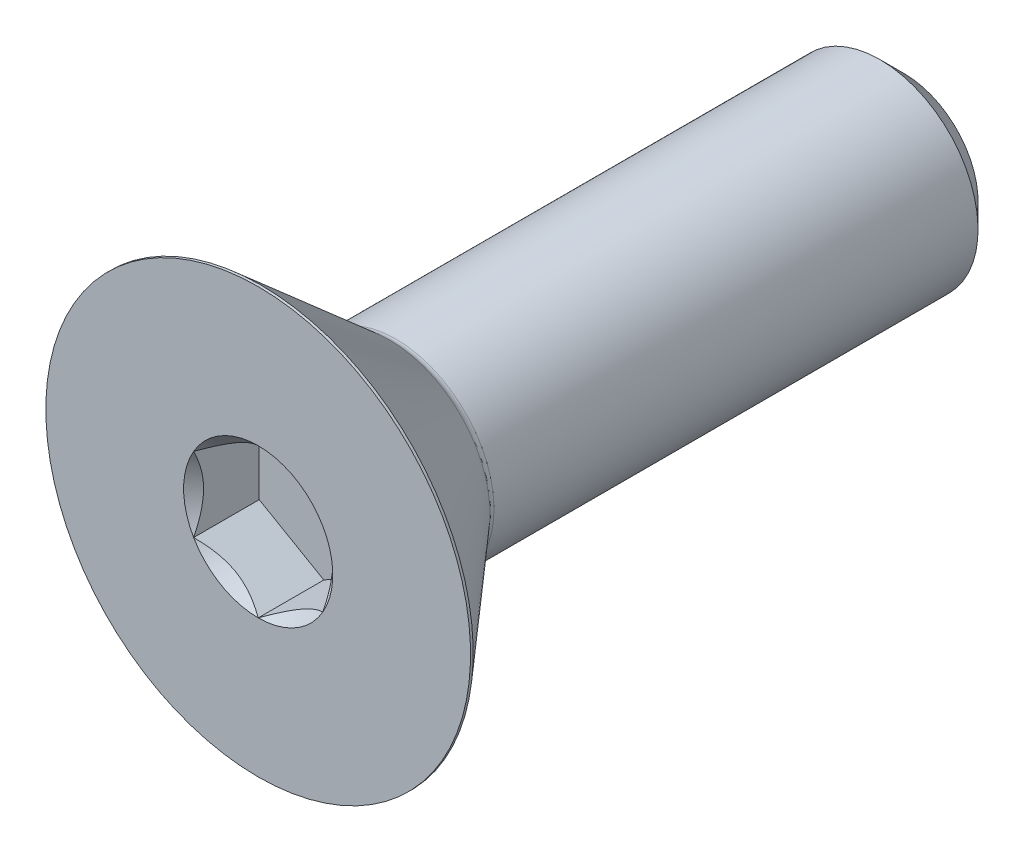
ISO-10303-21;
HEADER;
FILE_DESCRIPTION(('STEP AP214'),'2;1');
FILE_NAME('part.step','',(''),(''),'','','');
FILE_SCHEMA(('AUTOMOTIVE_DESIGN { 1 0 10303 214 1 1 1 1 }'));
ENDSEC;
DATA;
#1=APPLICATION_CONTEXT('core data for automotive mechanical design processes');
#2=APPLICATION_PROTOCOL_DEFINITION('international standard','automotive_design',2000,#1);
#3=PRODUCT_CONTEXT('',#1,'mechanical');
#4=PRODUCT('Part','Part','',(#3));
#5=PRODUCT_RELATED_PRODUCT_CATEGORY('part','',(#4));
#6=PRODUCT_DEFINITION_FORMATION('','',#4);
#7=PRODUCT_DEFINITION_CONTEXT('part definition',#1,'design');
#8=PRODUCT_DEFINITION('design','',#6,#7);
#9=PRODUCT_DEFINITION_SHAPE('','',#8);
#10=(LENGTH_UNIT() NAMED_UNIT(*) SI_UNIT(.MILLI.,.METRE.));
#11=(NAMED_UNIT(*) PLANE_ANGLE_UNIT() SI_UNIT($,.RADIAN.));
#12=(NAMED_UNIT(*) SI_UNIT($,.STERADIAN.) SOLID_ANGLE_UNIT());
#13=UNCERTAINTY_MEASURE_WITH_UNIT(LENGTH_MEASURE(1.E-05),#10,'distance_accuracy_value','');
#14=(GEOMETRIC_REPRESENTATION_CONTEXT(3) GLOBAL_UNCERTAINTY_ASSIGNED_CONTEXT((#13)) GLOBAL_UNIT_ASSIGNED_CONTEXT((#10,
#11,#12)) REPRESENTATION_CONTEXT('',''));
#15=CARTESIAN_POINT('',(0.,0.,0.));
#16=DIRECTION('',(0.,0.,1.));
#17=DIRECTION('',(1.,0.,0.));
#18=AXIS2_PLACEMENT_3D('',#15,#16,#17);
#19=CARTESIAN_POINT('',(0.,0.,7.9375));
#20=DIRECTION('',(0.,0.,1.));
#21=DIRECTION('',(1.,0.,0.));
#22=AXIS2_PLACEMENT_3D('',#19,#20,#21);
#23=CONICAL_SURFACE('',#22,1.83308710467706,0.78539816339745);
#24=CARTESIAN_POINT('',(0.,0.,7.9375));
#25=DIRECTION('',(0.,0.,1.));
#26=DIRECTION('',(1.,0.,0.));
#27=AXIS2_PLACEMENT_3D('',#24,#25,#26);
#28=CIRCLE('',#27,1.83308710467706);
#29=CARTESIAN_POINT('',(0.,-1.83308710467706,7.9375));
#30=VERTEX_POINT('',#29);
#31=CARTESIAN_POINT('',(1.5875,-0.916543552338532,7.9375));
#32=VERTEX_POINT('',#31);
#33=EDGE_CURVE('E236',#30,#32,#28,.T.);
#34=ORIENTED_EDGE('',*,*,#33,.T.);
#35=CARTESIAN_POINT('',(1.5877,-0.916428082284694,7.93761548096371));
#36=CARTESIAN_POINT('',(1.53312479190086,-0.94793709337181,7.9061308083706));
#37=CARTESIAN_POINT('',(1.47763696320971,-0.979973006203396,7.87649504601353));
#38=CARTESIAN_POINT('',(1.36449087915364,-1.04529792829092,7.82223226002082));
#39=CARTESIAN_POINT('',(1.30682185887062,-1.07859315267522,7.79763543513318));
#40=CARTESIAN_POINT('',(1.1905349781269,-1.14573141457583,7.75550036427258));
#41=CARTESIAN_POINT('',(1.13194674474407,-1.17955734689075,7.73785619272982));
#42=CARTESIAN_POINT('',(1.01348022674557,-1.24795402294715,7.71067147008497));
#43=CARTESIAN_POINT('',(0.953605562983894,-1.28252267618759,7.70111062069508));
#44=CARTESIAN_POINT('',(0.850418771876557,-1.34209759781022,7.69248441310401));
#45=CARTESIAN_POINT('',(0.807240015952287,-1.36702686416637,7.69120719280958));
#46=CARTESIAN_POINT('',(0.720953038535398,-1.41684467380557,7.6933570558147));
#47=CARTESIAN_POINT('',(0.677844847078611,-1.44173319974743,7.69678578854934));
#48=CARTESIAN_POINT('',(0.59204633500203,-1.49126899379091,7.70815099443334));
#49=CARTESIAN_POINT('',(0.549356408925406,-1.51591603410293,7.71609137180164));
#50=CARTESIAN_POINT('',(0.464693063478358,-1.56479643938728,7.7360484144511));
#51=CARTESIAN_POINT('',(0.422719959755074,-1.58902962212064,7.74806682920869));
#52=CARTESIAN_POINT('',(0.315211458113565,-1.65109968448354,7.78374689724725));
#53=CARTESIAN_POINT('',(0.250342771708899,-1.68855163804125,7.81009857230314));
#54=CARTESIAN_POINT('',(0.154961599380923,-1.74361998356043,7.8545835368517));
#55=CARTESIAN_POINT('',(0.123530699536156,-1.76176662204668,7.87021285780113));
#56=CARTESIAN_POINT('',(0.0612469855696364,-1.79772614107138,7.9028984878611));
#57=CARTESIAN_POINT('',(0.0303939039605762,-1.8155391760437,7.91995411565697));
#58=CARTESIAN_POINT('',(-0.000200000000000146,-1.8332025747309,7.93761548096371));
#59=B_SPLINE_CURVE_WITH_KNOTS('',3,(#35,#36,#37,#38,#39,#40,#41,#42,#43,#44,#45,#46,#47,#48,#49,
#50,#51,#52,#53,#54,#55,#56,#57,#58),.UNSPECIFIED.,.F.,.F.,(4,2,2,2,2,2,2,2,2,2,2,4),(0.,
0.211482650810816,0.424197870807276,0.633533884524816,0.842342653263348,0.991755553727141,
1.14122083674205,1.29081565918877,1.44047473906438,1.6781878086972,1.79671410024894,
1.91518409436631),.UNSPECIFIED.);
#60=EDGE_CURVE('E11',#32,#30,#59,.T.);
#61=ORIENTED_EDGE('',*,*,#60,.T.);
#62=EDGE_LOOP('',(#34,#61));
#63=FACE_BOUND('',#62,.T.);
#64=ADVANCED_FACE('F37',(#63),#23,.F.);
#65=CARTESIAN_POINT('',(-1.5875,-0.916543552338531,7.9375));
#66=VERTEX_POINT('',#65);
#67=EDGE_CURVE('E241',#66,#30,#28,.T.);
#68=ORIENTED_EDGE('',*,*,#67,.T.);
#69=CARTESIAN_POINT('',(0.000199999999999843,-1.8332025747309,7.93761548096371));
#70=CARTESIAN_POINT('',(-0.0543752080991363,-1.80169356364378,7.9061308083706));
#71=CARTESIAN_POINT('',(-0.10986303679029,-1.7696576508122,7.87649504601353));
#72=CARTESIAN_POINT('',(-0.223009120846358,-1.70433272872468,7.82223226002083));
#73=CARTESIAN_POINT('',(-0.280678141129381,-1.67103750434037,7.79763543513318));
#74=CARTESIAN_POINT('',(-0.396965021873103,-1.60389924243976,7.75550036427258));
#75=CARTESIAN_POINT('',(-0.455553255255931,-1.57007331012484,7.73785619272982));
#76=CARTESIAN_POINT('',(-0.57401977325443,-1.50167663406845,7.71067147008497));
#77=CARTESIAN_POINT('',(-0.633894437016105,-1.46710798082801,7.70111062069508));
#78=CARTESIAN_POINT('',(-0.737081228123442,-1.40753305920537,7.69248441310401));
#79=CARTESIAN_POINT('',(-0.780259984047712,-1.38260379284922,7.69120719280958));
#80=CARTESIAN_POINT('',(-0.866546961464601,-1.33278598321002,7.6933570558147));
#81=CARTESIAN_POINT('',(-0.909655152921388,-1.30789745726817,7.69678578854934));
#82=CARTESIAN_POINT('',(-0.995453664997969,-1.25836166322468,7.70815099443334));
#83=CARTESIAN_POINT('',(-1.03814359107459,-1.23371462291266,7.71609137180164));
#84=CARTESIAN_POINT('',(-1.12280693652164,-1.18483421762831,7.7360484144511));
#85=CARTESIAN_POINT('',(-1.16478004024492,-1.16060103489495,7.74806682920869));
#86=CARTESIAN_POINT('',(-1.27228854188643,-1.09853097253205,7.78374689724725));
#87=CARTESIAN_POINT('',(-1.3371572282911,-1.06107901897434,7.81009857230314));
#88=CARTESIAN_POINT('',(-1.43253840061908,-1.00601067345516,7.8545835368517));
#89=CARTESIAN_POINT('',(-1.46396930046384,-0.987864034968914,7.87021285780113));
#90=CARTESIAN_POINT('',(-1.52625301443036,-0.951904515944214,7.9028984878611));
#91=CARTESIAN_POINT('',(-1.55710609603942,-0.934091480971893,7.91995411565697));
#92=CARTESIAN_POINT('',(-1.5877,-0.916428082284693,7.93761548096371));
#93=B_SPLINE_CURVE_WITH_KNOTS('',3,(#69,#70,#71,#72,#73,#74,#75,#76,#77,#78,#79,#80,#81,#82,#83,
#84,#85,#86,#87,#88,#89,#90,#91,#92),.UNSPECIFIED.,.F.,.F.,(4,2,2,2,2,2,2,2,2,2,2,4),(0.,
0.211482650810816,0.424197870807275,0.633533884524815,0.842342653263348,0.991755553727141,
1.14122083674204,1.29081565918877,1.44047473906437,1.6781878086972,1.79671410024894,
1.91518409436631),.UNSPECIFIED.);
#94=EDGE_CURVE('E51',#30,#66,#93,.T.);
#95=ORIENTED_EDGE('',*,*,#94,.T.);
#96=EDGE_LOOP('',(#68,#95));
#97=FACE_BOUND('',#96,.T.);
#98=ADVANCED_FACE('F226',(#97),#23,.F.);
#99=CARTESIAN_POINT('',(-1.5875,0.916543552338532,7.9375));
#100=VERTEX_POINT('',#99);
#101=EDGE_CURVE('E242',#100,#66,#28,.T.);
#102=ORIENTED_EDGE('',*,*,#101,.T.);
#103=CARTESIAN_POINT('',(-1.5875,-1.84970477544497,8.5419452553756));
#104=CARTESIAN_POINT('',(-1.5875,-1.80476240151239,8.5078462071708));
#105=CARTESIAN_POINT('',(-1.5875,-1.75957199117801,8.47407501989281));
#106=CARTESIAN_POINT('',(-1.5875,-1.66859358881314,8.40732439135481));
#107=CARTESIAN_POINT('',(-1.5875,-1.62280545181692,8.37434514788516));
#108=CARTESIAN_POINT('',(-1.5875,-1.48372199901346,8.27632872516513));
#109=CARTESIAN_POINT('',(-1.5875,-1.38939051274161,8.21273763652916));
#110=CARTESIAN_POINT('',(-1.5875,-1.1914395580246,8.08769987514454));
#111=CARTESIAN_POINT('',(-1.5875,-1.08759987522282,8.02659794240349));
#112=CARTESIAN_POINT('',(-1.5875,-0.874706489386588,7.91468965372726));
#113=CARTESIAN_POINT('',(-1.5875,-0.765671975902254,7.86384856321849));
#114=CARTESIAN_POINT('',(-1.5875,-0.602217292000084,7.80164277390013));
#115=CARTESIAN_POINT('',(-1.5875,-0.550263299202901,7.78382619519952));
#116=CARTESIAN_POINT('',(-1.5875,-0.445082037721644,7.75236151406916));
#117=CARTESIAN_POINT('',(-1.5875,-0.391854683409843,7.73871369282369));
#118=CARTESIAN_POINT('',(-1.5875,-0.285344657080772,7.7165290273729));
#119=CARTESIAN_POINT('',(-1.5875,-0.23208080021017,7.70790327455853));
#120=CARTESIAN_POINT('',(-1.5875,-0.124959456415257,7.69593468251639));
#121=CARTESIAN_POINT('',(-1.5875,-0.0711020784671771,7.69259088922275));
#122=CARTESIAN_POINT('',(-1.5875,0.0346213127870739,7.69144382711086));
#123=CARTESIAN_POINT('',(-1.5875,0.0864851538798619,7.69343466080825));
#124=CARTESIAN_POINT('',(-1.5875,0.189778917943216,7.70238765275143));
#125=CARTESIAN_POINT('',(-1.5875,0.241208798942216,7.70935028640556));
#126=CARTESIAN_POINT('',(-1.5875,0.34413338388625,7.7279812853777));
#127=CARTESIAN_POINT('',(-1.5875,0.395613227208264,7.73973049498668));
#128=CARTESIAN_POINT('',(-1.5875,0.497445238808222,7.76730366113255));
#129=CARTESIAN_POINT('',(-1.5875,0.547797493505245,7.78312730423263));
#130=CARTESIAN_POINT('',(-1.5875,0.705347074888854,7.83861764108752));
#131=CARTESIAN_POINT('',(-1.5875,0.810327219424592,7.88456318469654));
#132=CARTESIAN_POINT('',(-1.5875,1.01536433721947,7.98674460760693));
#133=CARTESIAN_POINT('',(-1.5875,1.11540204185221,8.04301726027735));
#134=CARTESIAN_POINT('',(-1.5875,1.30660224236785,8.15914200882669));
#135=CARTESIAN_POINT('',(-1.5875,1.39795887507227,8.21867843332275));
#136=CARTESIAN_POINT('',(-1.5875,1.53255412415747,8.31072821439552));
#137=CARTESIAN_POINT('',(-1.5875,1.57683885315435,8.34173850209615));
#138=CARTESIAN_POINT('',(-1.5875,1.66480239811795,8.40458252247366));
#139=CARTESIAN_POINT('',(-1.5875,1.70848137749646,8.43641602616328));
#140=CARTESIAN_POINT('',(-1.5875,1.75190803967258,8.46859098283441));
#141=B_SPLINE_CURVE_WITH_KNOTS('',3,(#103,#104,#105,#106,#107,#108,#109,#110,#111,#112,#113,
#114,#115,#116,#117,#118,#119,#120,#121,#122,#123,#124,#125,#126,#127,#128,#129,#130,#131,#132,
#133,#134,#135,#136,#137,#138,#139,#140),.UNSPECIFIED.,.F.,.F.,(4,2,2,2,2,2,2,2,2,2,2,2,2,2,2,2,
2,2,4),(0.,0.169238364932429,0.338518567064951,0.679661123808214,1.04081978780735,
1.40073457216113,1.56536778601317,1.73001210198752,1.89164527462954,2.0532492485751,
2.2087065856554,2.36417878970806,2.52239358424591,2.68059621131738,3.0233722729095,
3.36739346781147,3.69436280662923,3.85654464660762,4.01868184900241),.UNSPECIFIED.);
#142=EDGE_CURVE('E200',#66,#100,#141,.T.);
#143=ORIENTED_EDGE('',*,*,#142,.T.);
#144=EDGE_LOOP('',(#102,#143));
#145=FACE_BOUND('',#144,.T.);
#146=ADVANCED_FACE('F232',(#145),#23,.F.);
#147=CARTESIAN_POINT('',(0.,1.83308710467706,7.9375));
#148=VERTEX_POINT('',#147);
#149=EDGE_CURVE('E144',#148,#100,#28,.T.);
#150=ORIENTED_EDGE('',*,*,#149,.T.);
#151=CARTESIAN_POINT('',(-1.5877,0.916428082284694,7.93761548096371));
#152=CARTESIAN_POINT('',(-1.53312479190086,0.94793709337181,7.9061308083706));
#153=CARTESIAN_POINT('',(-1.47763696320971,0.979973006203395,7.87649504601353));
#154=CARTESIAN_POINT('',(-1.36449087915364,1.04529792829092,7.82223226002082));
#155=CARTESIAN_POINT('',(-1.30682185887062,1.07859315267522,7.79763543513318));
#156=CARTESIAN_POINT('',(-1.1905349781269,1.14573141457583,7.75550036427258));
#157=CARTESIAN_POINT('',(-1.13194674474407,1.17955734689075,7.73785619272982));
#158=CARTESIAN_POINT('',(-1.01348022674557,1.24795402294714,7.71067147008497));
#159=CARTESIAN_POINT('',(-0.953605562983895,1.28252267618759,7.70111062069508));
#160=CARTESIAN_POINT('',(-0.850418771876558,1.34209759781022,7.69248441310401));
#161=CARTESIAN_POINT('',(-0.807240015952288,1.36702686416637,7.69120719280958));
#162=CARTESIAN_POINT('',(-0.720953038535399,1.41684467380557,7.6933570558147));
#163=CARTESIAN_POINT('',(-0.677844847078612,1.44173319974742,7.69678578854934));
#164=CARTESIAN_POINT('',(-0.592046335002031,1.49126899379091,7.70815099443334));
#165=CARTESIAN_POINT('',(-0.549356408925407,1.51591603410293,7.71609137180164));
#166=CARTESIAN_POINT('',(-0.464693063478359,1.56479643938728,7.7360484144511));
#167=CARTESIAN_POINT('',(-0.422719959755075,1.58902962212064,7.74806682920869));
#168=CARTESIAN_POINT('',(-0.315211458113566,1.65109968448354,7.78374689724725));
#169=CARTESIAN_POINT('',(-0.2503427717089,1.68855163804125,7.81009857230314));
#170=CARTESIAN_POINT('',(-0.154961599380924,1.74361998356043,7.8545835368517));
#171=CARTESIAN_POINT('',(-0.123530699536156,1.76176662204668,7.87021285780113));
#172=CARTESIAN_POINT('',(-0.0612469855696366,1.79772614107138,7.9028984878611));
#173=CARTESIAN_POINT('',(-0.0303939039605763,1.8155391760437,7.91995411565697));
#174=CARTESIAN_POINT('',(0.000200000000000034,1.8332025747309,7.93761548096371));
#175=B_SPLINE_CURVE_WITH_KNOTS('',3,(#151,#152,#153,#154,#155,#156,#157,#158,#159,#160,#161,
#162,#163,#164,#165,#166,#167,#168,#169,#170,#171,#172,#173,#174),.UNSPECIFIED.,.F.,.F.,(4,2,2,
2,2,2,2,2,2,2,2,4),(0.,0.211482650810816,0.424197870807276,0.633533884524816,0.842342653263348,
0.991755553727141,1.14122083674204,1.29081565918877,1.44047473906437,1.6781878086972,
1.79671410024894,1.91518409436631),.UNSPECIFIED.);
#176=EDGE_CURVE('E108',#100,#148,#175,.T.);
#177=ORIENTED_EDGE('',*,*,#176,.T.);
#178=EDGE_LOOP('',(#150,#177));
#179=FACE_BOUND('',#178,.T.);
#180=ADVANCED_FACE('F255',(#179),#23,.F.);
#181=CARTESIAN_POINT('',(1.5875,0.916543552338532,7.9375));
#182=VERTEX_POINT('',#181);
#183=EDGE_CURVE('E140',#182,#148,#28,.T.);
#184=ORIENTED_EDGE('',*,*,#183,.T.);
#185=CARTESIAN_POINT('',(-0.000199999999999648,1.8332025747309,7.93761548096371));
#186=CARTESIAN_POINT('',(0.0543752080991365,1.80169356364378,7.9061308083706));
#187=CARTESIAN_POINT('',(0.10986303679029,1.7696576508122,7.87649504601353));
#188=CARTESIAN_POINT('',(0.223009120846359,1.70433272872468,7.82223226002083));
#189=CARTESIAN_POINT('',(0.280678141129381,1.67103750434037,7.79763543513318));
#190=CARTESIAN_POINT('',(0.396965021873103,1.60389924243976,7.75550036427258));
#191=CARTESIAN_POINT('',(0.455553255255931,1.57007331012484,7.73785619272982));
#192=CARTESIAN_POINT('',(0.57401977325443,1.50167663406845,7.71067147008497));
#193=CARTESIAN_POINT('',(0.633894437016104,1.46710798082801,7.70111062069508));
#194=CARTESIAN_POINT('',(0.737081228123442,1.40753305920537,7.69248441310401));
#195=CARTESIAN_POINT('',(0.780259984047712,1.38260379284922,7.69120719280958));
#196=CARTESIAN_POINT('',(0.866546961464601,1.33278598321002,7.6933570558147));
#197=CARTESIAN_POINT('',(0.909655152921387,1.30789745726817,7.69678578854934));
#198=CARTESIAN_POINT('',(0.995453664997969,1.25836166322469,7.70815099443334));
#199=CARTESIAN_POINT('',(1.03814359107459,1.23371462291266,7.71609137180164));
#200=CARTESIAN_POINT('',(1.12280693652164,1.18483421762831,7.7360484144511));
#201=CARTESIAN_POINT('',(1.16478004024492,1.16060103489495,7.74806682920869));
#202=CARTESIAN_POINT('',(1.27228854188643,1.09853097253205,7.78374689724725));
#203=CARTESIAN_POINT('',(1.3371572282911,1.06107901897434,7.81009857230314));
#204=CARTESIAN_POINT('',(1.43253840061908,1.00601067345516,7.8545835368517));
#205=CARTESIAN_POINT('',(1.46396930046384,0.987864034968915,7.87021285780113));
#206=CARTESIAN_POINT('',(1.52625301443036,0.951904515944215,7.9028984878611));
#207=CARTESIAN_POINT('',(1.55710609603942,0.934091480971895,7.91995411565697));
#208=CARTESIAN_POINT('',(1.5877,0.916428082284694,7.93761548096371));
#209=B_SPLINE_CURVE_WITH_KNOTS('',3,(#185,#186,#187,#188,#189,#190,#191,#192,#193,#194,#195,
#196,#197,#198,#199,#200,#201,#202,#203,#204,#205,#206,#207,#208),.UNSPECIFIED.,.F.,.F.,(4,2,2,
2,2,2,2,2,2,2,2,4),(0.,0.211482650810816,0.424197870807275,0.633533884524814,0.842342653263347,
0.99175555372714,1.14122083674204,1.29081565918877,1.44047473906437,1.6781878086972,
1.79671410024894,1.91518409436631),.UNSPECIFIED.);
#210=EDGE_CURVE('E170',#148,#182,#209,.T.);
#211=ORIENTED_EDGE('',*,*,#210,.T.);
#212=EDGE_LOOP('',(#184,#211));
#213=FACE_BOUND('',#212,.T.);
#214=ADVANCED_FACE('F187',(#213),#23,.F.);
#215=CARTESIAN_POINT('',(0.,0.,-7.9375));
#216=DIRECTION('',(0.,0.,-1.));
#217=DIRECTION('',(0.,1.,0.));
#218=AXIS2_PLACEMENT_3D('',#215,#216,#217);
#219=CYLINDRICAL_SURFACE('',#218,5.2197);
#220=CARTESIAN_POINT('',(0.,0.,7.9375));
#221=DIRECTION('',(0.,0.,-1.));
#222=DIRECTION('',(0.,1.,0.));
#223=AXIS2_PLACEMENT_3D('',#220,#221,#222);
#224=CIRCLE('',#223,5.2197);
#225=CARTESIAN_POINT('',(0.,5.2197,7.9375));
#226=VERTEX_POINT('',#225);
#227=EDGE_CURVE('E159',#226,#226,#224,.T.);
#228=ORIENTED_EDGE('',*,*,#227,.T.);
#229=EDGE_LOOP('',(#228));
#230=FACE_BOUND('',#229,.T.);
#231=CARTESIAN_POINT('',(0.,0.,7.872984));
#232=DIRECTION('',(0.,0.,-1.));
#233=DIRECTION('',(0.,1.,0.));
#234=AXIS2_PLACEMENT_3D('',#231,#232,#233);
#235=CIRCLE('',#234,5.2197);
#236=CARTESIAN_POINT('',(0.,5.2197,7.872984));
#237=VERTEX_POINT('',#236);
#238=EDGE_CURVE('E143',#237,#237,#235,.T.);
#239=ORIENTED_EDGE('',*,*,#238,.F.);
#240=EDGE_LOOP('',(#239));
#241=FACE_BOUND('',#240,.T.);
#242=ADVANCED_FACE('F39',(#230,#241),#219,.T.);
#243=CARTESIAN_POINT('',(0.,0.,7.9375));
#244=DIRECTION('',(0.,0.,1.));
#245=DIRECTION('',(0.,-1.,0.));
#246=AXIS2_PLACEMENT_3D('',#243,#244,#245);
#247=PLANE('',#246);
#248=ORIENTED_EDGE('',*,*,#183,.F.);
#249=EDGE_CURVE('E133',#32,#182,#28,.T.);
#250=ORIENTED_EDGE('',*,*,#249,.F.);
#251=ORIENTED_EDGE('',*,*,#33,.F.);
#252=ORIENTED_EDGE('',*,*,#67,.F.);
#253=ORIENTED_EDGE('',*,*,#101,.F.);
#254=ORIENTED_EDGE('',*,*,#149,.F.);
#255=EDGE_LOOP('',(#248,#250,#251,#252,#253,#254));
#256=FACE_BOUND('',#255,.T.);
#257=ORIENTED_EDGE('',*,*,#227,.F.);
#258=EDGE_LOOP('',(#257));
#259=FACE_BOUND('',#258,.T.);
#260=ADVANCED_FACE('F246',(#256,#259),#247,.T.);
#261=CARTESIAN_POINT('',(0.,1.8176875,-7.9375));
#262=DIRECTION('',(0.,0.,-1.));
#263=DIRECTION('',(0.,1.,0.));
#264=AXIS2_PLACEMENT_3D('',#261,#262,#263);
#265=PLANE('',#264);
#266=CARTESIAN_POINT('',(0.,0.,-7.9375));
#267=DIRECTION('',(0.,0.,-1.));
#268=DIRECTION('',(0.,1.,0.));
#269=AXIS2_PLACEMENT_3D('',#266,#267,#268);
#270=CIRCLE('',#269,1.8176875);
#271=CARTESIAN_POINT('',(0.,1.8176875,-7.9375));
#272=VERTEX_POINT('',#271);
#273=EDGE_CURVE('E156',#272,#272,#270,.T.);
#274=ORIENTED_EDGE('',*,*,#273,.T.);
#275=EDGE_LOOP('',(#274));
#276=FACE_BOUND('',#275,.T.);
#277=ADVANCED_FACE('F315',(#276),#265,.T.);
#278=CARTESIAN_POINT('',(0.,0.,-7.9375));
#279=DIRECTION('',(0.,0.,1.));
#280=DIRECTION('',(0.,-1.,0.));
#281=AXIS2_PLACEMENT_3D('',#278,#279,#280);
#282=CONICAL_SURFACE('',#281,1.8176875,0.785398163397453);
#283=CARTESIAN_POINT('',(0.,0.,-7.3421875));
#284=DIRECTION('',(0.,0.,-1.));
#285=DIRECTION('',(0.,1.,0.));
#286=AXIS2_PLACEMENT_3D('',#283,#284,#285);
#287=CIRCLE('',#286,2.41300000000001);
#288=CARTESIAN_POINT('',(0.,2.413,-7.3421875));
#289=VERTEX_POINT('',#288);
#290=EDGE_CURVE('E153',#289,#289,#287,.T.);
#291=ORIENTED_EDGE('',*,*,#290,.T.);
#292=EDGE_LOOP('',(#291));
#293=FACE_BOUND('',#292,.T.);
#294=ORIENTED_EDGE('',*,*,#273,.F.);
#295=EDGE_LOOP('',(#294));
#296=FACE_BOUND('',#295,.T.);
#297=ADVANCED_FACE('F328',(#293,#296),#282,.T.);
#298=CARTESIAN_POINT('',(0.,0.,-7.9375));
#299=DIRECTION('',(0.,0.,-1.));
#300=DIRECTION('',(0.,1.,0.));
#301=AXIS2_PLACEMENT_3D('',#298,#299,#300);
#302=CYLINDRICAL_SURFACE('',#301,2.413);
#303=CARTESIAN_POINT('',(0.,0.,4.55486622866131));
#304=DIRECTION('',(0.,0.,-1.));
#305=DIRECTION('',(0.,1.,0.));
#306=AXIS2_PLACEMENT_3D('',#303,#304,#305);
#307=CIRCLE('',#306,2.413);
#308=CARTESIAN_POINT('',(0.,2.413,4.55486622866131));
#309=VERTEX_POINT('',#308);
#310=EDGE_CURVE('E150',#309,#309,#307,.T.);
#311=ORIENTED_EDGE('',*,*,#310,.T.);
#312=EDGE_LOOP('',(#311));
#313=FACE_BOUND('',#312,.T.);
#314=ORIENTED_EDGE('',*,*,#290,.F.);
#315=EDGE_LOOP('',(#314));
#316=FACE_BOUND('',#315,.T.);
#317=ADVANCED_FACE('F336',(#313,#316),#302,.T.);
#318=CARTESIAN_POINT('',(0.,0.,4.55486622866131));
#319=DIRECTION('',(0.,0.,-1.));
#320=DIRECTION('',(0.,1.,0.));
#321=AXIS2_PLACEMENT_3D('',#318,#319,#320);
#322=TOROIDAL_SURFACE('',#321,2.65205436006272,0.239054360062717);
#323=CARTESIAN_POINT('',(0.,0.,4.7117));
#324=DIRECTION('',(0.,0.,-1.));
#325=DIRECTION('',(0.,1.,0.));
#326=AXIS2_PLACEMENT_3D('',#323,#324,#325);
#327=CIRCLE('',#326,2.47163774432936);
#328=CARTESIAN_POINT('',(0.,2.47163774432936,4.7117));
#329=VERTEX_POINT('',#328);
#330=EDGE_CURVE('E147',#329,#329,#327,.T.);
#331=ORIENTED_EDGE('',*,*,#330,.T.);
#332=EDGE_LOOP('',(#331));
#333=FACE_BOUND('',#332,.T.);
#334=ORIENTED_EDGE('',*,*,#310,.F.);
#335=EDGE_LOOP('',(#334));
#336=FACE_BOUND('',#335,.T.);
#337=ADVANCED_FACE('F344',(#333,#336),#322,.F.);
#338=CARTESIAN_POINT('',(0.,0.,4.7117));
#339=DIRECTION('',(0.,0.,1.));
#340=DIRECTION('',(0.,-1.,0.));
#341=AXIS2_PLACEMENT_3D('',#338,#339,#340);
#342=CONICAL_SURFACE('',#341,2.47163774432936,0.715584993317677);
#343=ORIENTED_EDGE('',*,*,#238,.T.);
#344=EDGE_LOOP('',(#343));
#345=FACE_BOUND('',#344,.T.);
#346=ORIENTED_EDGE('',*,*,#330,.F.);
#347=EDGE_LOOP('',(#346));
#348=FACE_BOUND('',#347,.T.);
#349=ADVANCED_FACE('F185',(#345,#348),#342,.T.);
#350=ORIENTED_EDGE('',*,*,#249,.T.);
#351=CARTESIAN_POINT('',(1.5875,-1.84970477544497,8.5419452553756));
#352=CARTESIAN_POINT('',(1.5875,-1.80476240151239,8.5078462071708));
#353=CARTESIAN_POINT('',(1.5875,-1.75957199117802,8.47407501989281));
#354=CARTESIAN_POINT('',(1.5875,-1.66859358881315,8.40732439135482));
#355=CARTESIAN_POINT('',(1.5875,-1.62280545181693,8.37434514788516));
#356=CARTESIAN_POINT('',(1.5875,-1.48372199901347,8.27632872516513));
#357=CARTESIAN_POINT('',(1.5875,-1.38939051274161,8.21273763652916));
#358=CARTESIAN_POINT('',(1.5875,-1.1914395580246,8.08769987514454));
#359=CARTESIAN_POINT('',(1.5875,-1.08759987522283,8.02659794240349));
#360=CARTESIAN_POINT('',(1.5875,-0.87470648938659,7.91468965372726));
#361=CARTESIAN_POINT('',(1.5875,-0.765671975902255,7.86384856321849));
#362=CARTESIAN_POINT('',(1.5875,-0.602217292000085,7.80164277390013));
#363=CARTESIAN_POINT('',(1.5875,-0.550263299202902,7.78382619519952));
#364=CARTESIAN_POINT('',(1.5875,-0.445082037721645,7.75236151406916));
#365=CARTESIAN_POINT('',(1.5875,-0.391854683409844,7.73871369282369));
#366=CARTESIAN_POINT('',(1.5875,-0.285344657080773,7.7165290273729));
#367=CARTESIAN_POINT('',(1.5875,-0.232080800210171,7.70790327455853));
#368=CARTESIAN_POINT('',(1.5875,-0.124959456415258,7.69593468251639));
#369=CARTESIAN_POINT('',(1.5875,-0.0711020784671776,7.69259088922275));
#370=CARTESIAN_POINT('',(1.5875,0.0346213127870735,7.69144382711086));
#371=CARTESIAN_POINT('',(1.5875,0.0864851538798617,7.69343466080825));
#372=CARTESIAN_POINT('',(1.5875,0.189778917943216,7.70238765275143));
#373=CARTESIAN_POINT('',(1.5875,0.241208798942216,7.70935028640556));
#374=CARTESIAN_POINT('',(1.5875,0.34413338388625,7.7279812853777));
#375=CARTESIAN_POINT('',(1.5875,0.395613227208264,7.73973049498668));
#376=CARTESIAN_POINT('',(1.5875,0.497445238808222,7.76730366113255));
#377=CARTESIAN_POINT('',(1.5875,0.547797493505245,7.78312730423263));
#378=CARTESIAN_POINT('',(1.5875,0.705347074888855,7.83861764108752));
#379=CARTESIAN_POINT('',(1.5875,0.810327219424593,7.88456318469655));
#380=CARTESIAN_POINT('',(1.5875,1.01536433721947,7.98674460760694));
#381=CARTESIAN_POINT('',(1.5875,1.11540204185221,8.04301726027735));
#382=CARTESIAN_POINT('',(1.5875,1.30660224236785,8.15914200882669));
#383=CARTESIAN_POINT('',(1.5875,1.39795887507228,8.21867843332275));
#384=CARTESIAN_POINT('',(1.5875,1.53255412415747,8.31072821439552));
#385=CARTESIAN_POINT('',(1.5875,1.57683885315435,8.34173850209615));
#386=CARTESIAN_POINT('',(1.5875,1.66480239811795,8.40458252247367));
#387=CARTESIAN_POINT('',(1.5875,1.70848137749646,8.43641602616328));
#388=CARTESIAN_POINT('',(1.5875,1.75190803967258,8.46859098283441));
#389=B_SPLINE_CURVE_WITH_KNOTS('',3,(#351,#352,#353,#354,#355,#356,#357,#358,#359,#360,#361,
#362,#363,#364,#365,#366,#367,#368,#369,#370,#371,#372,#373,#374,#375,#376,#377,#378,#379,#380,
#381,#382,#383,#384,#385,#386,#387,#388),.UNSPECIFIED.,.F.,.F.,(4,2,2,2,2,2,2,2,2,2,2,2,2,2,2,2,
2,2,4),(0.,0.169238364932429,0.338518567064951,0.679661123808214,1.04081978780735,
1.40073457216113,1.56536778601317,1.73001210198752,1.89164527462955,2.0532492485751,
2.2087065856554,2.36417878970807,2.52239358424592,2.68059621131739,3.0233722729095,
3.36739346781148,3.69436280662924,3.85654464660763,4.01868184900242),.UNSPECIFIED.);
#390=EDGE_CURVE('E162',#182,#32,#389,.F.);
#391=ORIENTED_EDGE('',*,*,#390,.T.);
#392=EDGE_LOOP('',(#350,#391));
#393=FACE_BOUND('',#392,.T.);
#394=ADVANCED_FACE('F179',(#393),#23,.F.);
#395=CARTESIAN_POINT('',(0.,-1.83308710467706,6.3246));
#396=DIRECTION('',(0.5,-0.866025403784439,0.));
#397=DIRECTION('',(0.866025403784439,0.5,0.));
#398=AXIS2_PLACEMENT_3D('',#395,#396,#397);
#399=PLANE('',#398);
#400=DIRECTION('',(0.,0.,1.));
#401=VECTOR('',#400,1.);
#402=CARTESIAN_POINT('',(1.5875,-0.916543552338532,6.3246));
#403=LINE('',#402,#401);
#404=CARTESIAN_POINT('',(1.5875,-0.916543552338532,6.3246));
#405=VERTEX_POINT('',#404);
#406=EDGE_CURVE('E58',#405,#32,#403,.T.);
#407=ORIENTED_EDGE('',*,*,#406,.F.);
#408=DIRECTION('',(0.866025403784439,0.5,0.));
#409=VECTOR('',#408,1.);
#410=CARTESIAN_POINT('',(0.,-1.83308710467706,6.3246));
#411=LINE('',#410,#409);
#412=CARTESIAN_POINT('',(0.,-1.83308710467706,6.3246));
#413=VERTEX_POINT('',#412);
#414=EDGE_CURVE('E371',#413,#405,#411,.T.);
#415=ORIENTED_EDGE('',*,*,#414,.F.);
#416=DIRECTION('',(0.,0.,1.));
#417=VECTOR('',#416,1.);
#418=CARTESIAN_POINT('',(0.,-1.83308710467706,6.3246));
#419=LINE('',#418,#417);
#420=EDGE_CURVE('E67',#413,#30,#419,.T.);
#421=ORIENTED_EDGE('',*,*,#420,.T.);
#422=ORIENTED_EDGE('',*,*,#60,.F.);
#423=EDGE_LOOP('',(#407,#415,#421,#422));
#424=FACE_BOUND('',#423,.T.);
#425=ADVANCED_FACE('F184',(#424),#399,.F.);
#426=CARTESIAN_POINT('',(-1.5875,-0.916543552338531,6.3246));
#427=DIRECTION('',(-0.5,-0.866025403784439,0.));
#428=DIRECTION('',(0.866025403784439,-0.5,0.));
#429=AXIS2_PLACEMENT_3D('',#426,#427,#428);
#430=PLANE('',#429);
#431=ORIENTED_EDGE('',*,*,#420,.F.);
#432=DIRECTION('',(0.866025403784438,-0.5,0.));
#433=VECTOR('',#432,1.);
#434=CARTESIAN_POINT('',(-1.5875,-0.916543552338531,6.3246));
#435=LINE('',#434,#433);
#436=CARTESIAN_POINT('',(-1.5875,-0.916543552338531,6.3246));
#437=VERTEX_POINT('',#436);
#438=EDGE_CURVE('E119',#437,#413,#435,.T.);
#439=ORIENTED_EDGE('',*,*,#438,.F.);
#440=DIRECTION('',(0.,0.,1.));
#441=VECTOR('',#440,1.);
#442=CARTESIAN_POINT('',(-1.5875,-0.916543552338531,6.3246));
#443=LINE('',#442,#441);
#444=EDGE_CURVE('E111',#437,#66,#443,.T.);
#445=ORIENTED_EDGE('',*,*,#444,.T.);
#446=ORIENTED_EDGE('',*,*,#94,.F.);
#447=EDGE_LOOP('',(#431,#439,#445,#446));
#448=FACE_BOUND('',#447,.T.);
#449=ADVANCED_FACE('F211',(#448),#430,.F.);
#450=CARTESIAN_POINT('',(-1.5875,0.916543552338532,6.3246));
#451=DIRECTION('',(-1.,0.,0.));
#452=DIRECTION('',(0.,0.,1.));
#453=AXIS2_PLACEMENT_3D('',#450,#451,#452);
#454=PLANE('',#453);
#455=ORIENTED_EDGE('',*,*,#444,.F.);
#456=DIRECTION('',(0.,-1.,0.));
#457=VECTOR('',#456,1.);
#458=CARTESIAN_POINT('',(-1.5875,0.916543552338532,6.3246));
#459=LINE('',#458,#457);
#460=CARTESIAN_POINT('',(-1.5875,0.916543552338532,6.3246));
#461=VERTEX_POINT('',#460);
#462=EDGE_CURVE('E115',#461,#437,#459,.T.);
#463=ORIENTED_EDGE('',*,*,#462,.F.);
#464=DIRECTION('',(0.,0.,1.));
#465=VECTOR('',#464,1.);
#466=CARTESIAN_POINT('',(-1.5875,0.916543552338532,6.3246));
#467=LINE('',#466,#465);
#468=EDGE_CURVE('E100',#461,#100,#467,.T.);
#469=ORIENTED_EDGE('',*,*,#468,.T.);
#470=ORIENTED_EDGE('',*,*,#142,.F.);
#471=EDGE_LOOP('',(#455,#463,#469,#470));
#472=FACE_BOUND('',#471,.T.);
#473=ADVANCED_FACE('F116',(#472),#454,.F.);
#474=CARTESIAN_POINT('',(0.,1.83308710467706,6.3246));
#475=DIRECTION('',(-0.5,0.866025403784439,0.));
#476=DIRECTION('',(-0.866025403784439,-0.5,0.));
#477=AXIS2_PLACEMENT_3D('',#474,#475,#476);
#478=PLANE('',#477);
#479=ORIENTED_EDGE('',*,*,#468,.F.);
#480=DIRECTION('',(-0.866025403784439,-0.5,0.));
#481=VECTOR('',#480,1.);
#482=CARTESIAN_POINT('',(0.,1.83308710467706,6.3246));
#483=LINE('',#482,#481);
#484=CARTESIAN_POINT('',(0.,1.83308710467706,6.3246));
#485=VERTEX_POINT('',#484);
#486=EDGE_CURVE('E105',#485,#461,#483,.T.);
#487=ORIENTED_EDGE('',*,*,#486,.F.);
#488=DIRECTION('',(0.,0.,1.));
#489=VECTOR('',#488,1.);
#490=CARTESIAN_POINT('',(0.,1.83308710467706,6.3246));
#491=LINE('',#490,#489);
#492=EDGE_CURVE('E112',#485,#148,#491,.T.);
#493=ORIENTED_EDGE('',*,*,#492,.T.);
#494=ORIENTED_EDGE('',*,*,#176,.F.);
#495=EDGE_LOOP('',(#479,#487,#493,#494));
#496=FACE_BOUND('',#495,.T.);
#497=ADVANCED_FACE('F102',(#496),#478,.F.);
#498=CARTESIAN_POINT('',(1.5875,0.916543552338532,6.3246));
#499=DIRECTION('',(0.5,0.866025403784438,0.));
#500=DIRECTION('',(-0.866025403784439,0.5,0.));
#501=AXIS2_PLACEMENT_3D('',#498,#499,#500);
#502=PLANE('',#501);
#503=ORIENTED_EDGE('',*,*,#492,.F.);
#504=DIRECTION('',(-0.866025403784439,0.5,0.));
#505=VECTOR('',#504,1.);
#506=CARTESIAN_POINT('',(1.5875,0.916543552338532,6.3246));
#507=LINE('',#506,#505);
#508=CARTESIAN_POINT('',(1.5875,0.916543552338532,6.3246));
#509=VERTEX_POINT('',#508);
#510=EDGE_CURVE('E125',#509,#485,#507,.T.);
#511=ORIENTED_EDGE('',*,*,#510,.F.);
#512=DIRECTION('',(0.,0.,1.));
#513=VECTOR('',#512,1.);
#514=CARTESIAN_POINT('',(1.5875,0.916543552338532,6.3246));
#515=LINE('',#514,#513);
#516=EDGE_CURVE('E136',#509,#182,#515,.T.);
#517=ORIENTED_EDGE('',*,*,#516,.T.);
#518=ORIENTED_EDGE('',*,*,#210,.F.);
#519=EDGE_LOOP('',(#503,#511,#517,#518));
#520=FACE_BOUND('',#519,.T.);
#521=ADVANCED_FACE('F218',(#520),#502,.F.);
#522=CARTESIAN_POINT('',(1.5875,-0.916543552338532,6.3246));
#523=DIRECTION('',(1.,0.,0.));
#524=DIRECTION('',(0.,1.,0.));
#525=AXIS2_PLACEMENT_3D('',#522,#523,#524);
#526=PLANE('',#525);
#527=ORIENTED_EDGE('',*,*,#516,.F.);
#528=DIRECTION('',(0.,1.,0.));
#529=VECTOR('',#528,1.);
#530=CARTESIAN_POINT('',(1.5875,-0.916543552338532,6.3246));
#531=LINE('',#530,#529);
#532=EDGE_CURVE('E127',#405,#509,#531,.T.);
#533=ORIENTED_EDGE('',*,*,#532,.F.);
#534=ORIENTED_EDGE('',*,*,#406,.T.);
#535=ORIENTED_EDGE('',*,*,#390,.F.);
#536=EDGE_LOOP('',(#527,#533,#534,#535));
#537=FACE_BOUND('',#536,.T.);
#538=ADVANCED_FACE('F177',(#537),#526,.F.);
#539=CARTESIAN_POINT('',(0.,0.,6.3246));
#540=DIRECTION('',(0.,0.,1.));
#541=DIRECTION('',(1.,0.,0.));
#542=AXIS2_PLACEMENT_3D('',#539,#540,#541);
#543=PLANE('',#542);
#544=ORIENTED_EDGE('',*,*,#414,.T.);
#545=ORIENTED_EDGE('',*,*,#532,.T.);
#546=ORIENTED_EDGE('',*,*,#510,.T.);
#547=ORIENTED_EDGE('',*,*,#486,.T.);
#548=ORIENTED_EDGE('',*,*,#462,.T.);
#549=ORIENTED_EDGE('',*,*,#438,.T.);
#550=EDGE_LOOP('',(#544,#545,#546,#547,#548,#549));
#551=FACE_BOUND('',#550,.T.);
#552=ADVANCED_FACE('F122',(#551),#543,.T.);
#553=CLOSED_SHELL('',(#64,#98,#146,#180,#214,#242,#260,#277,#297,#317,#337,#349,#394,#425,#449,
#473,#497,#521,#538,#552));
#554=MANIFOLD_SOLID_BREP('B2',#553);
#555=ADVANCED_BREP_SHAPE_REPRESENTATION('',(#18,#554),#14);
#556=SHAPE_DEFINITION_REPRESENTATION(#9,#555);
ENDSEC;
END-ISO-10303-21;
